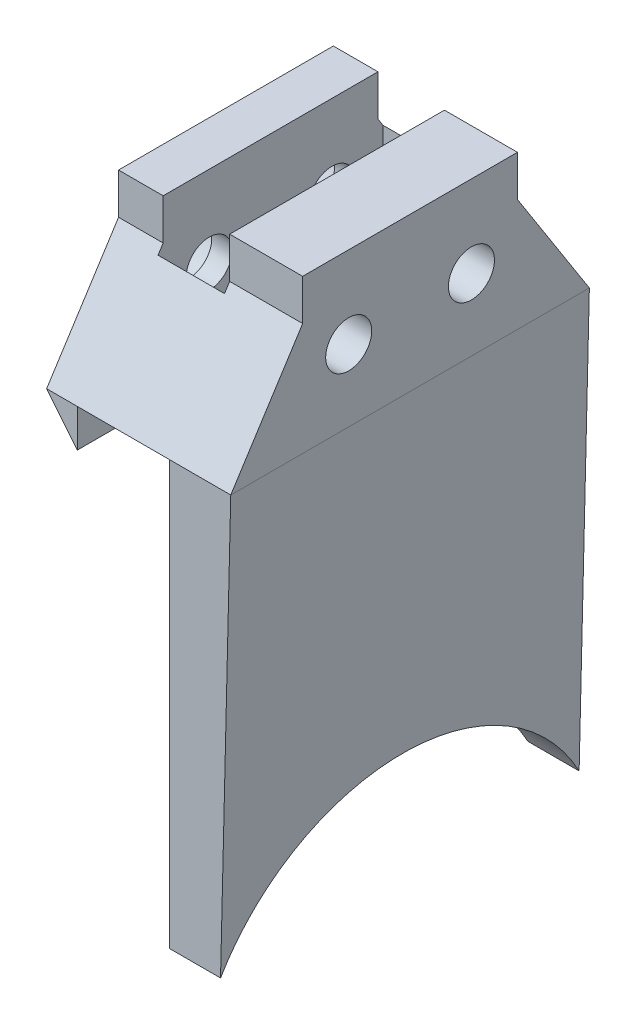
ISO-10303-21;
HEADER;
FILE_DESCRIPTION(('STEP AP214'),'2;1');
FILE_NAME('part.step','',(''),(''),'','','');
FILE_SCHEMA(('AUTOMOTIVE_DESIGN { 1 0 10303 214 1 1 1 1 }'));
ENDSEC;
DATA;
#1=APPLICATION_CONTEXT('core data for automotive mechanical design processes');
#2=APPLICATION_PROTOCOL_DEFINITION('international standard','automotive_design',2000,#1);
#3=PRODUCT_CONTEXT('',#1,'mechanical');
#4=PRODUCT('Part','Part','',(#3));
#5=PRODUCT_RELATED_PRODUCT_CATEGORY('part','',(#4));
#6=PRODUCT_DEFINITION_FORMATION('','',#4);
#7=PRODUCT_DEFINITION_CONTEXT('part definition',#1,'design');
#8=PRODUCT_DEFINITION('design','',#6,#7);
#9=PRODUCT_DEFINITION_SHAPE('','',#8);
#10=(LENGTH_UNIT() NAMED_UNIT(*) SI_UNIT(.MILLI.,.METRE.));
#11=(NAMED_UNIT(*) PLANE_ANGLE_UNIT() SI_UNIT($,.RADIAN.));
#12=(NAMED_UNIT(*) SI_UNIT($,.STERADIAN.) SOLID_ANGLE_UNIT());
#13=UNCERTAINTY_MEASURE_WITH_UNIT(LENGTH_MEASURE(1.E-05),#10,'distance_accuracy_value','');
#14=(GEOMETRIC_REPRESENTATION_CONTEXT(3) GLOBAL_UNCERTAINTY_ASSIGNED_CONTEXT((#13)) GLOBAL_UNIT_ASSIGNED_CONTEXT((#10,
#11,#12)) REPRESENTATION_CONTEXT('',''));
#15=CARTESIAN_POINT('',(0.,0.,0.));
#16=DIRECTION('',(0.,0.,1.));
#17=DIRECTION('',(1.,0.,0.));
#18=AXIS2_PLACEMENT_3D('',#15,#16,#17);
#19=CARTESIAN_POINT('',(6.,-7.5,35.0588586));
#20=DIRECTION('',(0.,1.,0.));
#21=DIRECTION('',(-1.,0.,0.));
#22=AXIS2_PLACEMENT_3D('',#19,#20,#21);
#23=PLANE('',#22);
#24=DIRECTION('',(-1.,0.,0.));
#25=VECTOR('',#24,1.);
#26=CARTESIAN_POINT('',(-1.6375,-7.5,6.5294293));
#27=LINE('',#26,#25);
#28=CARTESIAN_POINT('',(4.8625,-7.5,6.5294293));
#29=VERTEX_POINT('',#28);
#30=CARTESIAN_POINT('',(-1.6375,-7.5,6.5294293));
#31=VERTEX_POINT('',#30);
#32=EDGE_CURVE('E241',#29,#31,#27,.T.);
#33=ORIENTED_EDGE('',*,*,#32,.T.);
#34=DIRECTION('',(0.,0.,1.));
#35=VECTOR('',#34,1.);
#36=CARTESIAN_POINT('',(-1.6375,-7.5,6.5294293));
#37=LINE('',#36,#35);
#38=CARTESIAN_POINT('',(-1.6375,-7.5,28.5294293));
#39=VERTEX_POINT('',#38);
#40=EDGE_CURVE('E233',#31,#39,#37,.T.);
#41=ORIENTED_EDGE('',*,*,#40,.T.);
#42=DIRECTION('',(1.,0.,0.));
#43=VECTOR('',#42,1.);
#44=CARTESIAN_POINT('',(-1.6375,-7.5,28.5294293));
#45=LINE('',#44,#43);
#46=CARTESIAN_POINT('',(4.8625,-7.5,28.5294293));
#47=VERTEX_POINT('',#46);
#48=EDGE_CURVE('E236',#39,#47,#45,.T.);
#49=ORIENTED_EDGE('',*,*,#48,.T.);
#50=DIRECTION('',(0.,0.,-1.));
#51=VECTOR('',#50,1.);
#52=CARTESIAN_POINT('',(4.8625,-7.5,6.5294293));
#53=LINE('',#52,#51);
#54=EDGE_CURVE('E68',#47,#29,#53,.T.);
#55=ORIENTED_EDGE('',*,*,#54,.T.);
#56=EDGE_LOOP('',(#33,#41,#49,#55));
#57=FACE_BOUND('',#56,.T.);
#58=DIRECTION('',(0.,0.,-1.));
#59=VECTOR('',#58,1.);
#60=CARTESIAN_POINT('',(-3.,-7.49999999999995,35.0588586));
#61=LINE('',#60,#59);
#62=CARTESIAN_POINT('',(-3.,-7.5,35.0588586));
#63=VERTEX_POINT('',#62);
#64=CARTESIAN_POINT('',(-3.,-7.49999999999995,0.));
#65=VERTEX_POINT('',#64);
#66=EDGE_CURVE('E198',#63,#65,#61,.T.);
#67=ORIENTED_EDGE('',*,*,#66,.T.);
#68=DIRECTION('',(1.,0.,0.));
#69=VECTOR('',#68,1.);
#70=CARTESIAN_POINT('',(6.,-7.5,0.));
#71=LINE('',#70,#69);
#72=CARTESIAN_POINT('',(6.,-7.49999999999995,0.));
#73=VERTEX_POINT('',#72);
#74=EDGE_CURVE('E334',#65,#73,#71,.T.);
#75=ORIENTED_EDGE('',*,*,#74,.T.);
#76=DIRECTION('',(0.,0.,-1.));
#77=VECTOR('',#76,1.);
#78=CARTESIAN_POINT('',(6.,-7.5,35.0588586));
#79=LINE('',#78,#77);
#80=CARTESIAN_POINT('',(6.,-7.49999999999995,35.0588586));
#81=VERTEX_POINT('',#80);
#82=EDGE_CURVE('E342',#81,#73,#79,.T.);
#83=ORIENTED_EDGE('',*,*,#82,.F.);
#84=DIRECTION('',(1.,0.,0.));
#85=VECTOR('',#84,1.);
#86=CARTESIAN_POINT('',(6.,-7.5,35.0588586));
#87=LINE('',#86,#85);
#88=EDGE_CURVE('E60',#63,#81,#87,.T.);
#89=ORIENTED_EDGE('',*,*,#88,.F.);
#90=EDGE_LOOP('',(#67,#75,#83,#89));
#91=FACE_BOUND('',#90,.T.);
#92=ADVANCED_FACE('F43',(#57,#91),#23,.F.);
#93=CARTESIAN_POINT('',(12.,-0.499999999999999,23.5294293));
#94=DIRECTION('',(-1.,0.,0.));
#95=DIRECTION('',(0.,-1.,0.));
#96=AXIS2_PLACEMENT_3D('',#93,#94,#95);
#97=CYLINDRICAL_SURFACE('',#96,2.25);
#98=CARTESIAN_POINT('',(-1.6375,-0.5,23.5294293));
#99=DIRECTION('',(-1.,0.,0.));
#100=DIRECTION('',(0.,0.,1.));
#101=AXIS2_PLACEMENT_3D('',#98,#99,#100);
#102=CIRCLE('',#101,2.25);
#103=CARTESIAN_POINT('',(-1.6375,-0.5,25.7794293));
#104=VERTEX_POINT('',#103);
#105=EDGE_CURVE('E225',#104,#104,#102,.T.);
#106=ORIENTED_EDGE('',*,*,#105,.F.);
#107=EDGE_LOOP('',(#106));
#108=FACE_BOUND('',#107,.T.);
#109=CARTESIAN_POINT('',(-3.6375,-0.5,23.5294293));
#110=DIRECTION('',(-1.,0.,0.));
#111=DIRECTION('',(0.,-1.,0.));
#112=AXIS2_PLACEMENT_3D('',#109,#110,#111);
#113=CIRCLE('',#112,2.25);
#114=CARTESIAN_POINT('',(-3.6375,-2.75,23.5294293));
#115=VERTEX_POINT('',#114);
#116=EDGE_CURVE('E47',#115,#115,#113,.F.);
#117=ORIENTED_EDGE('',*,*,#116,.F.);
#118=EDGE_LOOP('',(#117));
#119=FACE_BOUND('',#118,.T.);
#120=ADVANCED_FACE('F366',(#108,#119),#97,.F.);
#121=CARTESIAN_POINT('',(12.,-0.499999999999999,11.5294293));
#122=DIRECTION('',(-1.,0.,0.));
#123=DIRECTION('',(0.,-1.,0.));
#124=AXIS2_PLACEMENT_3D('',#121,#122,#123);
#125=CYLINDRICAL_SURFACE('',#124,2.25);
#126=CARTESIAN_POINT('',(-1.6375,-0.5,11.5294293));
#127=DIRECTION('',(-1.,0.,0.));
#128=DIRECTION('',(0.,0.,1.));
#129=AXIS2_PLACEMENT_3D('',#126,#127,#128);
#130=CIRCLE('',#129,2.25);
#131=CARTESIAN_POINT('',(-1.6375,-0.5,13.7794293));
#132=VERTEX_POINT('',#131);
#133=EDGE_CURVE('E229',#132,#132,#130,.T.);
#134=ORIENTED_EDGE('',*,*,#133,.F.);
#135=EDGE_LOOP('',(#134));
#136=FACE_BOUND('',#135,.T.);
#137=CARTESIAN_POINT('',(-3.6375,-0.5,11.5294293));
#138=DIRECTION('',(-1.,0.,0.));
#139=DIRECTION('',(0.,-1.,0.));
#140=AXIS2_PLACEMENT_3D('',#137,#138,#139);
#141=CIRCLE('',#140,2.25);
#142=CARTESIAN_POINT('',(-3.6375,-2.75,11.5294293));
#143=VERTEX_POINT('',#142);
#144=EDGE_CURVE('E209',#143,#143,#141,.F.);
#145=ORIENTED_EDGE('',*,*,#144,.F.);
#146=EDGE_LOOP('',(#145));
#147=FACE_BOUND('',#146,.T.);
#148=ADVANCED_FACE('F368',(#136,#147),#125,.F.);
#149=CARTESIAN_POINT('',(6.,7.5,35.0588586));
#150=DIRECTION('',(0.,-1.,0.));
#151=DIRECTION('',(1.,0.,0.));
#152=AXIS2_PLACEMENT_3D('',#149,#150,#151);
#153=PLANE('',#152);
#154=DIRECTION('',(-1.,0.,0.));
#155=VECTOR('',#154,1.);
#156=CARTESIAN_POINT('',(12.,7.49999999999995,28.0294293));
#157=LINE('',#156,#155);
#158=CARTESIAN_POINT('',(-1.6375,7.5,28.0294293));
#159=VERTEX_POINT('',#158);
#160=CARTESIAN_POINT('',(-6.,7.49999999999995,28.0294293));
#161=VERTEX_POINT('',#160);
#162=EDGE_CURVE('E309',#159,#161,#157,.T.);
#163=ORIENTED_EDGE('',*,*,#162,.F.);
#164=DIRECTION('',(0.,0.,1.));
#165=VECTOR('',#164,1.);
#166=CARTESIAN_POINT('',(-1.6375,7.5,6.5294293));
#167=LINE('',#166,#165);
#168=CARTESIAN_POINT('',(-1.6375,7.5,7.0294293));
#169=VERTEX_POINT('',#168);
#170=EDGE_CURVE('E232',#169,#159,#167,.T.);
#171=ORIENTED_EDGE('',*,*,#170,.F.);
#172=DIRECTION('',(-1.,0.,0.));
#173=VECTOR('',#172,1.);
#174=CARTESIAN_POINT('',(12.,7.49999999999995,7.0294293));
#175=LINE('',#174,#173);
#176=CARTESIAN_POINT('',(-6.,7.5,7.0294293));
#177=VERTEX_POINT('',#176);
#178=EDGE_CURVE('E281',#169,#177,#175,.T.);
#179=ORIENTED_EDGE('',*,*,#178,.T.);
#180=DIRECTION('',(0.,0.,-1.));
#181=VECTOR('',#180,1.);
#182=CARTESIAN_POINT('',(-6.,7.5,35.0588586));
#183=LINE('',#182,#181);
#184=EDGE_CURVE('E336',#161,#177,#183,.T.);
#185=ORIENTED_EDGE('',*,*,#184,.F.);
#186=EDGE_LOOP('',(#163,#171,#179,#185));
#187=FACE_BOUND('',#186,.T.);
#188=ADVANCED_FACE('F376',(#187),#153,.F.);
#189=CARTESIAN_POINT('',(12.,7.49999999999995,28.0294293));
#190=DIRECTION('',(0.,0.,1.));
#191=DIRECTION('',(0.,-1.,0.));
#192=AXIS2_PLACEMENT_3D('',#189,#190,#191);
#193=PLANE('',#192);
#194=DIRECTION('',(0.,-1.,0.));
#195=VECTOR('',#194,1.);
#196=CARTESIAN_POINT('',(-1.6375,7.49999999999995,28.0294293));
#197=LINE('',#196,#195);
#198=CARTESIAN_POINT('',(-1.6375,3.49999999999995,28.0294293));
#199=VERTEX_POINT('',#198);
#200=EDGE_CURVE('E267',#159,#199,#197,.T.);
#201=ORIENTED_EDGE('',*,*,#200,.F.);
#202=ORIENTED_EDGE('',*,*,#162,.T.);
#203=DIRECTION('',(0.,1.,0.));
#204=VECTOR('',#203,1.);
#205=CARTESIAN_POINT('',(-6.,7.49999999999995,28.0294293));
#206=LINE('',#205,#204);
#207=CARTESIAN_POINT('',(-6.,3.49999999999995,28.0294293));
#208=VERTEX_POINT('',#207);
#209=EDGE_CURVE('E269',#208,#161,#206,.T.);
#210=ORIENTED_EDGE('',*,*,#209,.F.);
#211=DIRECTION('',(-1.,0.,0.));
#212=VECTOR('',#211,1.);
#213=CARTESIAN_POINT('',(12.,3.49999999999995,28.0294293));
#214=LINE('',#213,#212);
#215=EDGE_CURVE('E302',#199,#208,#214,.T.);
#216=ORIENTED_EDGE('',*,*,#215,.F.);
#217=EDGE_LOOP('',(#201,#202,#210,#216));
#218=FACE_BOUND('',#217,.T.);
#219=ADVANCED_FACE('F476',(#218),#193,.T.);
#220=CARTESIAN_POINT('',(12.,7.49999999999995,7.0294293));
#221=DIRECTION('',(0.,0.,-1.));
#222=DIRECTION('',(0.,1.,0.));
#223=AXIS2_PLACEMENT_3D('',#220,#221,#222);
#224=PLANE('',#223);
#225=DIRECTION('',(0.,1.,0.));
#226=VECTOR('',#225,1.);
#227=CARTESIAN_POINT('',(-1.6375,7.49999999999995,7.0294293));
#228=LINE('',#227,#226);
#229=CARTESIAN_POINT('',(-1.6375,3.49999999999995,7.0294293));
#230=VERTEX_POINT('',#229);
#231=EDGE_CURVE('E263',#230,#169,#228,.T.);
#232=ORIENTED_EDGE('',*,*,#231,.F.);
#233=DIRECTION('',(-1.,0.,0.));
#234=VECTOR('',#233,1.);
#235=CARTESIAN_POINT('',(12.,3.49999999999995,7.0294293));
#236=LINE('',#235,#234);
#237=CARTESIAN_POINT('',(-6.,3.49999999999995,7.0294293));
#238=VERTEX_POINT('',#237);
#239=EDGE_CURVE('E288',#230,#238,#236,.T.);
#240=ORIENTED_EDGE('',*,*,#239,.T.);
#241=DIRECTION('',(0.,-1.,0.));
#242=VECTOR('',#241,1.);
#243=CARTESIAN_POINT('',(-6.,7.49999999999995,7.0294293));
#244=LINE('',#243,#242);
#245=EDGE_CURVE('E270',#177,#238,#244,.T.);
#246=ORIENTED_EDGE('',*,*,#245,.F.);
#247=ORIENTED_EDGE('',*,*,#178,.F.);
#248=EDGE_LOOP('',(#232,#240,#246,#247));
#249=FACE_BOUND('',#248,.T.);
#250=ADVANCED_FACE('F465',(#249),#224,.T.);
#251=CARTESIAN_POINT('',(0.,0.,35.0588586));
#252=DIRECTION('',(0.,0.,-1.));
#253=DIRECTION('',(-1.,0.,0.));
#254=AXIS2_PLACEMENT_3D('',#251,#252,#253);
#255=PLANE('',#254);
#256=DIRECTION('',(-1.,0.,0.));
#257=VECTOR('',#256,1.);
#258=CARTESIAN_POINT('',(12.,-7.49999999999995,35.0588586));
#259=LINE('',#258,#257);
#260=CARTESIAN_POINT('',(12.,-7.49999999999995,35.0588586));
#261=VERTEX_POINT('',#260);
#262=EDGE_CURVE('E306',#261,#81,#259,.T.);
#263=ORIENTED_EDGE('',*,*,#262,.T.);
#264=DIRECTION('',(0.,-1.,0.));
#265=VECTOR('',#264,1.);
#266=CARTESIAN_POINT('',(6.,7.5,35.0588586));
#267=LINE('',#266,#265);
#268=CARTESIAN_POINT('',(6.00000000000001,-48.8959251,35.0588586));
#269=VERTEX_POINT('',#268);
#270=EDGE_CURVE('E326',#81,#269,#267,.T.);
#271=ORIENTED_EDGE('',*,*,#270,.T.);
#272=DIRECTION('',(-1.,0.,0.));
#273=VECTOR('',#272,1.);
#274=CARTESIAN_POINT('',(12.,-48.8959251,35.0588586));
#275=LINE('',#274,#273);
#276=CARTESIAN_POINT('',(11.,-48.8959251,35.0588586));
#277=VERTEX_POINT('',#276);
#278=EDGE_CURVE('E332',#277,#269,#275,.T.);
#279=ORIENTED_EDGE('',*,*,#278,.F.);
#280=DIRECTION('',(-0.0241499216576646,-0.999708348111552,0.));
#281=VECTOR('',#280,1.);
#282=CARTESIAN_POINT('',(12.1740729625627,-0.294088679819423,35.0588586));
#283=LINE('',#282,#281);
#284=EDGE_CURVE('E314',#261,#277,#283,.T.);
#285=ORIENTED_EDGE('',*,*,#284,.F.);
#286=EDGE_LOOP('',(#263,#271,#279,#285));
#287=FACE_BOUND('',#286,.T.);
#288=ADVANCED_FACE('F440',(#287),#255,.F.);
#289=CARTESIAN_POINT('',(0.,0.,0.));
#290=DIRECTION('',(0.,0.,-1.));
#291=DIRECTION('',(-1.,0.,0.));
#292=AXIS2_PLACEMENT_3D('',#289,#290,#291);
#293=PLANE('',#292);
#294=DIRECTION('',(0.,1.,0.));
#295=VECTOR('',#294,1.);
#296=CARTESIAN_POINT('',(6.,7.5,0.));
#297=LINE('',#296,#295);
#298=CARTESIAN_POINT('',(6.00000000000001,-48.8959251,0.));
#299=VERTEX_POINT('',#298);
#300=EDGE_CURVE('E318',#299,#73,#297,.T.);
#301=ORIENTED_EDGE('',*,*,#300,.T.);
#302=DIRECTION('',(-1.,0.,0.));
#303=VECTOR('',#302,1.);
#304=CARTESIAN_POINT('',(12.,-7.49999999999995,0.));
#305=LINE('',#304,#303);
#306=CARTESIAN_POINT('',(12.,-7.49999999999995,0.));
#307=VERTEX_POINT('',#306);
#308=EDGE_CURVE('E285',#307,#73,#305,.T.);
#309=ORIENTED_EDGE('',*,*,#308,.F.);
#310=DIRECTION('',(-0.0241499216576646,-0.999708348111552,0.));
#311=VECTOR('',#310,1.);
#312=CARTESIAN_POINT('',(12.1740729625627,-0.294088679819423,0.));
#313=LINE('',#312,#311);
#314=CARTESIAN_POINT('',(11.,-48.8959251,0.));
#315=VERTEX_POINT('',#314);
#316=EDGE_CURVE('E292',#307,#315,#313,.T.);
#317=ORIENTED_EDGE('',*,*,#316,.T.);
#318=DIRECTION('',(-1.,0.,0.));
#319=VECTOR('',#318,1.);
#320=CARTESIAN_POINT('',(12.,-48.8959251,0.));
#321=LINE('',#320,#319);
#322=EDGE_CURVE('E322',#315,#299,#321,.T.);
#323=ORIENTED_EDGE('',*,*,#322,.T.);
#324=EDGE_LOOP('',(#301,#309,#317,#323));
#325=FACE_BOUND('',#324,.T.);
#326=ADVANCED_FACE('F455',(#325),#293,.T.);
#327=CARTESIAN_POINT('',(12.,-58.5250012974502,17.5294293));
#328=DIRECTION('',(1.,0.,0.));
#329=DIRECTION('',(0.,1.,0.));
#330=AXIS2_PLACEMENT_3D('',#327,#328,#329);
#331=PLANE('',#330);
#332=CARTESIAN_POINT('',(12.,-0.499999999999999,11.5294293));
#333=DIRECTION('',(-1.,0.,0.));
#334=DIRECTION('',(0.,-1.,0.));
#335=AXIS2_PLACEMENT_3D('',#332,#333,#334);
#336=CIRCLE('',#335,2.25);
#337=CARTESIAN_POINT('',(12.,-2.75,11.5294293));
#338=VERTEX_POINT('',#337);
#339=EDGE_CURVE('E218',#338,#338,#336,.T.);
#340=ORIENTED_EDGE('',*,*,#339,.T.);
#341=EDGE_LOOP('',(#340));
#342=FACE_BOUND('',#341,.T.);
#343=CARTESIAN_POINT('',(12.,-0.499999999999999,23.5294293));
#344=DIRECTION('',(-1.,0.,0.));
#345=DIRECTION('',(0.,-1.,0.));
#346=AXIS2_PLACEMENT_3D('',#343,#344,#345);
#347=CIRCLE('',#346,2.25);
#348=CARTESIAN_POINT('',(12.,-2.75,23.5294293));
#349=VERTEX_POINT('',#348);
#350=EDGE_CURVE('E222',#349,#349,#347,.T.);
#351=ORIENTED_EDGE('',*,*,#350,.T.);
#352=EDGE_LOOP('',(#351));
#353=FACE_BOUND('',#352,.T.);
#354=DIRECTION('',(0.,-0.842638856504142,-0.538479115202615));
#355=VECTOR('',#354,1.);
#356=CARTESIAN_POINT('',(12.,3.49999999999995,7.0294293));
#357=LINE('',#356,#355);
#358=CARTESIAN_POINT('',(12.,3.49999999999995,7.0294293));
#359=VERTEX_POINT('',#358);
#360=EDGE_CURVE('E279',#359,#307,#357,.T.);
#361=ORIENTED_EDGE('',*,*,#360,.F.);
#362=DIRECTION('',(0.,-1.,0.));
#363=VECTOR('',#362,1.);
#364=CARTESIAN_POINT('',(12.,7.49999999999995,7.0294293));
#365=LINE('',#364,#363);
#366=CARTESIAN_POINT('',(12.,7.49999999999995,7.0294293));
#367=VERTEX_POINT('',#366);
#368=EDGE_CURVE('E277',#367,#359,#365,.T.);
#369=ORIENTED_EDGE('',*,*,#368,.F.);
#370=DIRECTION('',(0.,0.,1.));
#371=VECTOR('',#370,1.);
#372=CARTESIAN_POINT('',(12.,7.5,0.));
#373=LINE('',#372,#371);
#374=CARTESIAN_POINT('',(12.,7.5,28.0294293));
#375=VERTEX_POINT('',#374);
#376=EDGE_CURVE('E319',#367,#375,#373,.T.);
#377=ORIENTED_EDGE('',*,*,#376,.T.);
#378=DIRECTION('',(0.,1.,0.));
#379=VECTOR('',#378,1.);
#380=CARTESIAN_POINT('',(12.,7.49999999999995,28.0294293));
#381=LINE('',#380,#379);
#382=CARTESIAN_POINT('',(12.,3.49999999999995,28.0294293));
#383=VERTEX_POINT('',#382);
#384=EDGE_CURVE('E298',#383,#375,#381,.T.);
#385=ORIENTED_EDGE('',*,*,#384,.F.);
#386=DIRECTION('',(0.,0.842638856504142,-0.538479115202615));
#387=VECTOR('',#386,1.);
#388=CARTESIAN_POINT('',(12.,3.49999999999995,28.0294293));
#389=LINE('',#388,#387);
#390=EDGE_CURVE('E300',#261,#383,#389,.T.);
#391=ORIENTED_EDGE('',*,*,#390,.F.);
#392=DIRECTION('',(0.,0.,-1.));
#393=VECTOR('',#392,1.);
#394=CARTESIAN_POINT('',(12.,-7.50000000000017,17.5294293));
#395=LINE('',#394,#393);
#396=EDGE_CURVE('E347',#261,#307,#395,.T.);
#397=ORIENTED_EDGE('',*,*,#396,.T.);
#398=EDGE_LOOP('',(#361,#369,#377,#385,#391,#397));
#399=FACE_BOUND('',#398,.T.);
#400=ADVANCED_FACE('F418',(#342,#353,#399),#331,.T.);
#401=CARTESIAN_POINT('',(-6.,7.5,35.0588586));
#402=DIRECTION('',(1.,0.,0.));
#403=DIRECTION('',(0.,1.,0.));
#404=AXIS2_PLACEMENT_3D('',#401,#402,#403);
#405=PLANE('',#404);
#406=CARTESIAN_POINT('',(-6.,-0.500000000000001,11.5294293));
#407=DIRECTION('',(-1.,0.,0.));
#408=DIRECTION('',(0.,-1.,0.));
#409=AXIS2_PLACEMENT_3D('',#406,#407,#408);
#410=CIRCLE('',#409,3.75);
#411=CARTESIAN_POINT('',(-6.,-4.25,11.5294293));
#412=VERTEX_POINT('',#411);
#413=EDGE_CURVE('E210',#412,#412,#410,.T.);
#414=ORIENTED_EDGE('',*,*,#413,.F.);
#415=EDGE_LOOP('',(#414));
#416=FACE_BOUND('',#415,.T.);
#417=CARTESIAN_POINT('',(-6.,-0.500000000000001,23.5294293));
#418=DIRECTION('',(-1.,0.,0.));
#419=DIRECTION('',(0.,-1.,0.));
#420=AXIS2_PLACEMENT_3D('',#417,#418,#419);
#421=CIRCLE('',#420,3.75);
#422=CARTESIAN_POINT('',(-6.,-4.25,23.5294293));
#423=VERTEX_POINT('',#422);
#424=EDGE_CURVE('E197',#423,#423,#421,.T.);
#425=ORIENTED_EDGE('',*,*,#424,.F.);
#426=EDGE_LOOP('',(#425));
#427=FACE_BOUND('',#426,.T.);
#428=ORIENTED_EDGE('',*,*,#245,.T.);
#429=DIRECTION('',(0.,-0.842638856504142,-0.538479115202615));
#430=VECTOR('',#429,1.);
#431=CARTESIAN_POINT('',(-6.,3.49999999999995,7.0294293));
#432=LINE('',#431,#430);
#433=CARTESIAN_POINT('',(-6.,-7.49999999999995,0.));
#434=VERTEX_POINT('',#433);
#435=EDGE_CURVE('E273',#238,#434,#432,.T.);
#436=ORIENTED_EDGE('',*,*,#435,.T.);
#437=DIRECTION('',(0.,0.,-1.));
#438=VECTOR('',#437,1.);
#439=CARTESIAN_POINT('',(-6.,-7.5,35.0588586));
#440=LINE('',#439,#438);
#441=CARTESIAN_POINT('',(-6.,-7.49999999999995,35.0588586));
#442=VERTEX_POINT('',#441);
#443=EDGE_CURVE('E345',#442,#434,#440,.T.);
#444=ORIENTED_EDGE('',*,*,#443,.F.);
#445=DIRECTION('',(0.,0.842638856504142,-0.538479115202615));
#446=VECTOR('',#445,1.);
#447=CARTESIAN_POINT('',(-6.,3.49999999999995,28.0294293));
#448=LINE('',#447,#446);
#449=EDGE_CURVE('E295',#442,#208,#448,.T.);
#450=ORIENTED_EDGE('',*,*,#449,.T.);
#451=ORIENTED_EDGE('',*,*,#209,.T.);
#452=ORIENTED_EDGE('',*,*,#184,.T.);
#453=EDGE_LOOP('',(#428,#436,#444,#450,#451,#452));
#454=FACE_BOUND('',#453,.T.);
#455=ADVANCED_FACE('F45',(#416,#427,#454),#405,.F.);
#456=CARTESIAN_POINT('',(4.8625,7.5,7.0294293));
#457=VERTEX_POINT('',#456);
#458=EDGE_CURVE('E282',#367,#457,#175,.T.);
#459=ORIENTED_EDGE('',*,*,#458,.T.);
#460=DIRECTION('',(0.,0.,-1.));
#461=VECTOR('',#460,1.);
#462=CARTESIAN_POINT('',(4.8625,7.5,6.5294293));
#463=LINE('',#462,#461);
#464=CARTESIAN_POINT('',(4.8625,7.5,28.0294293));
#465=VERTEX_POINT('',#464);
#466=EDGE_CURVE('E237',#465,#457,#463,.T.);
#467=ORIENTED_EDGE('',*,*,#466,.F.);
#468=EDGE_CURVE('E274',#375,#465,#157,.T.);
#469=ORIENTED_EDGE('',*,*,#468,.F.);
#470=ORIENTED_EDGE('',*,*,#376,.F.);
#471=EDGE_LOOP('',(#459,#467,#469,#470));
#472=FACE_BOUND('',#471,.T.);
#473=ADVANCED_FACE('F411',(#472),#153,.F.);
#474=CARTESIAN_POINT('',(12.,-58.5250012974502,17.5294293));
#475=DIRECTION('',(-1.,0.,0.));
#476=DIRECTION('',(0.,-1.,0.));
#477=AXIS2_PLACEMENT_3D('',#474,#475,#476);
#478=CYLINDRICAL_SURFACE('',#477,20.);
#479=CARTESIAN_POINT('',(10.7673907232611,-58.5250012974502,17.5294293));
#480=DIRECTION('',(0.999708348111552,-0.0241499216576646,0.));
#481=DIRECTION('',(-0.0241499216576646,-0.999708348111552,0.));
#482=AXIS2_PLACEMENT_3D('',#479,#480,#481);
#483=ELLIPSE('',#482,20.0058347394817,20.);
#484=EDGE_CURVE('E316',#277,#315,#483,.F.);
#485=ORIENTED_EDGE('',*,*,#484,.F.);
#486=ORIENTED_EDGE('',*,*,#278,.T.);
#487=CARTESIAN_POINT('',(6.00000000000001,-58.5250012974502,17.5294293));
#488=DIRECTION('',(-1.,0.,0.));
#489=DIRECTION('',(0.,1.,0.));
#490=AXIS2_PLACEMENT_3D('',#487,#488,#489);
#491=CIRCLE('',#490,20.);
#492=EDGE_CURVE('E323',#269,#299,#491,.T.);
#493=ORIENTED_EDGE('',*,*,#492,.T.);
#494=ORIENTED_EDGE('',*,*,#322,.F.);
#495=EDGE_LOOP('',(#485,#486,#493,#494));
#496=FACE_BOUND('',#495,.T.);
#497=ADVANCED_FACE('F450',(#496),#478,.F.);
#498=CARTESIAN_POINT('',(6.00000000000001,-58.5250012974502,17.5294293));
#499=DIRECTION('',(1.,0.,0.));
#500=DIRECTION('',(0.,1.,0.));
#501=AXIS2_PLACEMENT_3D('',#498,#499,#500);
#502=PLANE('',#501);
#503=ORIENTED_EDGE('',*,*,#270,.F.);
#504=ORIENTED_EDGE('',*,*,#82,.T.);
#505=ORIENTED_EDGE('',*,*,#300,.F.);
#506=ORIENTED_EDGE('',*,*,#492,.F.);
#507=EDGE_LOOP('',(#503,#504,#505,#506));
#508=FACE_BOUND('',#507,.T.);
#509=ADVANCED_FACE('F446',(#508),#502,.F.);
#510=CARTESIAN_POINT('',(12.1740729625627,-0.294088679819423,0.));
#511=DIRECTION('',(0.999708348111552,-0.0241499216576646,0.));
#512=DIRECTION('',(0.0241499216576646,0.999708348111552,0.));
#513=AXIS2_PLACEMENT_3D('',#510,#511,#512);
#514=PLANE('',#513);
#515=ORIENTED_EDGE('',*,*,#484,.T.);
#516=ORIENTED_EDGE('',*,*,#316,.F.);
#517=ORIENTED_EDGE('',*,*,#396,.F.);
#518=ORIENTED_EDGE('',*,*,#284,.T.);
#519=EDGE_LOOP('',(#515,#516,#517,#518));
#520=FACE_BOUND('',#519,.T.);
#521=ADVANCED_FACE('F453',(#520),#514,.T.);
#522=DIRECTION('',(0.,1.,0.));
#523=VECTOR('',#522,1.);
#524=CARTESIAN_POINT('',(4.8625,7.49999999999995,28.0294293));
#525=LINE('',#524,#523);
#526=CARTESIAN_POINT('',(4.8625,3.49999999999995,28.0294293));
#527=VERTEX_POINT('',#526);
#528=EDGE_CURVE('E261',#527,#465,#525,.T.);
#529=ORIENTED_EDGE('',*,*,#528,.F.);
#530=EDGE_CURVE('E303',#383,#527,#214,.T.);
#531=ORIENTED_EDGE('',*,*,#530,.F.);
#532=ORIENTED_EDGE('',*,*,#384,.T.);
#533=ORIENTED_EDGE('',*,*,#468,.T.);
#534=EDGE_LOOP('',(#529,#531,#532,#533));
#535=FACE_BOUND('',#534,.T.);
#536=ADVANCED_FACE('F413',(#535),#193,.T.);
#537=CARTESIAN_POINT('',(12.,3.49999999999995,28.0294293));
#538=DIRECTION('',(0.,0.538479115202615,0.842638856504142));
#539=DIRECTION('',(0.,-0.842638856504142,0.538479115202615));
#540=AXIS2_PLACEMENT_3D('',#537,#538,#539);
#541=PLANE('',#540);
#542=DIRECTION('',(0.,-0.842638856504142,0.538479115202615));
#543=VECTOR('',#542,1.);
#544=CARTESIAN_POINT('',(-1.6375,3.49999999999995,28.0294293));
#545=LINE('',#544,#543);
#546=CARTESIAN_POINT('',(-1.6375,2.71757517356346,28.5294293));
#547=VERTEX_POINT('',#546);
#548=EDGE_CURVE('E265',#199,#547,#545,.T.);
#549=ORIENTED_EDGE('',*,*,#548,.F.);
#550=ORIENTED_EDGE('',*,*,#215,.T.);
#551=ORIENTED_EDGE('',*,*,#449,.F.);
#552=EDGE_CURVE('E184',#442,#63,#87,.T.);
#553=ORIENTED_EDGE('',*,*,#552,.T.);
#554=ORIENTED_EDGE('',*,*,#88,.T.);
#555=ORIENTED_EDGE('',*,*,#262,.F.);
#556=ORIENTED_EDGE('',*,*,#390,.T.);
#557=ORIENTED_EDGE('',*,*,#530,.T.);
#558=DIRECTION('',(0.,0.842638856504142,-0.538479115202615));
#559=VECTOR('',#558,1.);
#560=CARTESIAN_POINT('',(4.8625,3.49999999999995,28.0294293));
#561=LINE('',#560,#559);
#562=CARTESIAN_POINT('',(4.8625,2.71757517356346,28.5294293));
#563=VERTEX_POINT('',#562);
#564=EDGE_CURVE('E259',#563,#527,#561,.T.);
#565=ORIENTED_EDGE('',*,*,#564,.F.);
#566=DIRECTION('',(1.,0.,0.));
#567=VECTOR('',#566,1.);
#568=CARTESIAN_POINT('',(12.,2.71757517356346,28.5294293));
#569=LINE('',#568,#567);
#570=EDGE_CURVE('E11',#547,#563,#569,.T.);
#571=ORIENTED_EDGE('',*,*,#570,.F.);
#572=EDGE_LOOP('',(#549,#550,#551,#553,#554,#555,#556,#557,#565,#571));
#573=FACE_BOUND('',#572,.T.);
#574=ADVANCED_FACE('F437',(#573),#541,.T.);
#575=DIRECTION('',(0.,-1.,0.));
#576=VECTOR('',#575,1.);
#577=CARTESIAN_POINT('',(4.8625,7.49999999999995,7.0294293));
#578=LINE('',#577,#576);
#579=CARTESIAN_POINT('',(4.8625,3.49999999999995,7.0294293));
#580=VERTEX_POINT('',#579);
#581=EDGE_CURVE('E250',#457,#580,#578,.T.);
#582=ORIENTED_EDGE('',*,*,#581,.F.);
#583=ORIENTED_EDGE('',*,*,#458,.F.);
#584=ORIENTED_EDGE('',*,*,#368,.T.);
#585=EDGE_CURVE('E289',#359,#580,#236,.T.);
#586=ORIENTED_EDGE('',*,*,#585,.T.);
#587=EDGE_LOOP('',(#582,#583,#584,#586));
#588=FACE_BOUND('',#587,.T.);
#589=ADVANCED_FACE('F423',(#588),#224,.T.);
#590=CARTESIAN_POINT('',(12.,3.49999999999995,7.0294293));
#591=DIRECTION('',(0.,0.538479115202615,-0.842638856504142));
#592=DIRECTION('',(0.,0.842638856504142,0.538479115202615));
#593=AXIS2_PLACEMENT_3D('',#590,#591,#592);
#594=PLANE('',#593);
#595=DIRECTION('',(0.,0.842638856504142,0.538479115202615));
#596=VECTOR('',#595,1.);
#597=CARTESIAN_POINT('',(-1.6375,3.49999999999995,7.0294293));
#598=LINE('',#597,#596);
#599=CARTESIAN_POINT('',(-1.6375,2.71757517356348,6.5294293));
#600=VERTEX_POINT('',#599);
#601=EDGE_CURVE('E52',#600,#230,#598,.T.);
#602=ORIENTED_EDGE('',*,*,#601,.F.);
#603=DIRECTION('',(-1.,0.,0.));
#604=VECTOR('',#603,1.);
#605=CARTESIAN_POINT('',(12.,2.71757517356348,6.5294293));
#606=LINE('',#605,#604);
#607=CARTESIAN_POINT('',(4.8625,2.71757517356348,6.5294293));
#608=VERTEX_POINT('',#607);
#609=EDGE_CURVE('E352',#608,#600,#606,.T.);
#610=ORIENTED_EDGE('',*,*,#609,.F.);
#611=DIRECTION('',(0.,-0.842638856504142,-0.538479115202615));
#612=VECTOR('',#611,1.);
#613=CARTESIAN_POINT('',(4.8625,3.49999999999995,7.0294293));
#614=LINE('',#613,#612);
#615=EDGE_CURVE('E350',#580,#608,#614,.T.);
#616=ORIENTED_EDGE('',*,*,#615,.F.);
#617=ORIENTED_EDGE('',*,*,#585,.F.);
#618=ORIENTED_EDGE('',*,*,#360,.T.);
#619=ORIENTED_EDGE('',*,*,#308,.T.);
#620=ORIENTED_EDGE('',*,*,#74,.F.);
#621=EDGE_CURVE('E337',#434,#65,#71,.T.);
#622=ORIENTED_EDGE('',*,*,#621,.F.);
#623=ORIENTED_EDGE('',*,*,#435,.F.);
#624=ORIENTED_EDGE('',*,*,#239,.F.);
#625=EDGE_LOOP('',(#602,#610,#616,#617,#618,#619,#620,#622,#623,#624));
#626=FACE_BOUND('',#625,.T.);
#627=ADVANCED_FACE('F427',(#626),#594,.T.);
#628=CARTESIAN_POINT('',(-1.6375,-7.5,6.5294293));
#629=DIRECTION('',(-1.,0.,0.));
#630=DIRECTION('',(0.,0.,1.));
#631=AXIS2_PLACEMENT_3D('',#628,#629,#630);
#632=PLANE('',#631);
#633=ORIENTED_EDGE('',*,*,#133,.T.);
#634=EDGE_LOOP('',(#633));
#635=FACE_BOUND('',#634,.T.);
#636=ORIENTED_EDGE('',*,*,#105,.T.);
#637=EDGE_LOOP('',(#636));
#638=FACE_BOUND('',#637,.T.);
#639=ORIENTED_EDGE('',*,*,#200,.T.);
#640=ORIENTED_EDGE('',*,*,#548,.T.);
#641=DIRECTION('',(0.,1.,0.));
#642=VECTOR('',#641,1.);
#643=CARTESIAN_POINT('',(-1.6375,-7.5,28.5294293));
#644=LINE('',#643,#642);
#645=EDGE_CURVE('E244',#39,#547,#644,.T.);
#646=ORIENTED_EDGE('',*,*,#645,.F.);
#647=ORIENTED_EDGE('',*,*,#40,.F.);
#648=DIRECTION('',(0.,1.,0.));
#649=VECTOR('',#648,1.);
#650=CARTESIAN_POINT('',(-1.6375,-7.5,6.5294293));
#651=LINE('',#650,#649);
#652=EDGE_CURVE('E247',#31,#600,#651,.T.);
#653=ORIENTED_EDGE('',*,*,#652,.T.);
#654=ORIENTED_EDGE('',*,*,#601,.T.);
#655=ORIENTED_EDGE('',*,*,#231,.T.);
#656=ORIENTED_EDGE('',*,*,#170,.T.);
#657=EDGE_LOOP('',(#639,#640,#646,#647,#653,#654,#655,#656));
#658=FACE_BOUND('',#657,.T.);
#659=ADVANCED_FACE('F469',(#635,#638,#658),#632,.F.);
#660=CARTESIAN_POINT('',(-1.6375,-7.5,6.5294293));
#661=DIRECTION('',(0.,0.,-1.));
#662=DIRECTION('',(-1.,0.,0.));
#663=AXIS2_PLACEMENT_3D('',#660,#661,#662);
#664=PLANE('',#663);
#665=ORIENTED_EDGE('',*,*,#609,.T.);
#666=ORIENTED_EDGE('',*,*,#652,.F.);
#667=ORIENTED_EDGE('',*,*,#32,.F.);
#668=DIRECTION('',(0.,1.,0.));
#669=VECTOR('',#668,1.);
#670=CARTESIAN_POINT('',(4.8625,-7.5,6.5294293));
#671=LINE('',#670,#669);
#672=EDGE_CURVE('E251',#29,#608,#671,.T.);
#673=ORIENTED_EDGE('',*,*,#672,.T.);
#674=EDGE_LOOP('',(#665,#666,#667,#673));
#675=FACE_BOUND('',#674,.T.);
#676=ADVANCED_FACE('F400',(#675),#664,.F.);
#677=CARTESIAN_POINT('',(4.8625,-7.5,6.5294293));
#678=DIRECTION('',(1.,0.,0.));
#679=DIRECTION('',(0.,0.,-1.));
#680=AXIS2_PLACEMENT_3D('',#677,#678,#679);
#681=PLANE('',#680);
#682=CARTESIAN_POINT('',(4.8625,-0.499999999999999,11.5294293));
#683=DIRECTION('',(1.,0.,0.));
#684=DIRECTION('',(0.,0.,-1.));
#685=AXIS2_PLACEMENT_3D('',#682,#683,#684);
#686=CIRCLE('',#685,2.25);
#687=CARTESIAN_POINT('',(4.8625,-0.499999999999999,9.2794293));
#688=VERTEX_POINT('',#687);
#689=EDGE_CURVE('E228',#688,#688,#686,.T.);
#690=ORIENTED_EDGE('',*,*,#689,.T.);
#691=EDGE_LOOP('',(#690));
#692=FACE_BOUND('',#691,.T.);
#693=CARTESIAN_POINT('',(4.8625,-0.499999999999999,23.5294293));
#694=DIRECTION('',(1.,0.,0.));
#695=DIRECTION('',(0.,0.,-1.));
#696=AXIS2_PLACEMENT_3D('',#693,#694,#695);
#697=CIRCLE('',#696,2.25);
#698=CARTESIAN_POINT('',(4.8625,-0.499999999999999,21.2794293));
#699=VERTEX_POINT('',#698);
#700=EDGE_CURVE('E221',#699,#699,#697,.T.);
#701=ORIENTED_EDGE('',*,*,#700,.T.);
#702=EDGE_LOOP('',(#701));
#703=FACE_BOUND('',#702,.T.);
#704=ORIENTED_EDGE('',*,*,#528,.T.);
#705=ORIENTED_EDGE('',*,*,#466,.T.);
#706=ORIENTED_EDGE('',*,*,#581,.T.);
#707=ORIENTED_EDGE('',*,*,#615,.T.);
#708=ORIENTED_EDGE('',*,*,#672,.F.);
#709=ORIENTED_EDGE('',*,*,#54,.F.);
#710=DIRECTION('',(0.,1.,0.));
#711=VECTOR('',#710,1.);
#712=CARTESIAN_POINT('',(4.8625,-7.5,28.5294293));
#713=LINE('',#712,#711);
#714=EDGE_CURVE('E254',#47,#563,#713,.T.);
#715=ORIENTED_EDGE('',*,*,#714,.T.);
#716=ORIENTED_EDGE('',*,*,#564,.T.);
#717=EDGE_LOOP('',(#704,#705,#706,#707,#708,#709,#715,#716));
#718=FACE_BOUND('',#717,.T.);
#719=ADVANCED_FACE('F393',(#692,#703,#718),#681,.F.);
#720=CARTESIAN_POINT('',(-1.6375,-7.5,28.5294293));
#721=DIRECTION('',(0.,0.,1.));
#722=DIRECTION('',(1.,0.,0.));
#723=AXIS2_PLACEMENT_3D('',#720,#721,#722);
#724=PLANE('',#723);
#725=ORIENTED_EDGE('',*,*,#570,.T.);
#726=ORIENTED_EDGE('',*,*,#714,.F.);
#727=ORIENTED_EDGE('',*,*,#48,.F.);
#728=ORIENTED_EDGE('',*,*,#645,.T.);
#729=EDGE_LOOP('',(#725,#726,#727,#728));
#730=FACE_BOUND('',#729,.T.);
#731=ADVANCED_FACE('F385',(#730),#724,.F.);
#732=ORIENTED_EDGE('',*,*,#350,.F.);
#733=EDGE_LOOP('',(#732));
#734=FACE_BOUND('',#733,.T.);
#735=ORIENTED_EDGE('',*,*,#700,.F.);
#736=EDGE_LOOP('',(#735));
#737=FACE_BOUND('',#736,.T.);
#738=ADVANCED_FACE('F371',(#734,#737),#97,.F.);
#739=ORIENTED_EDGE('',*,*,#339,.F.);
#740=EDGE_LOOP('',(#739));
#741=FACE_BOUND('',#740,.T.);
#742=ORIENTED_EDGE('',*,*,#689,.F.);
#743=EDGE_LOOP('',(#742));
#744=FACE_BOUND('',#743,.T.);
#745=ADVANCED_FACE('F379',(#741,#744),#125,.F.);
#746=CARTESIAN_POINT('',(-3.6375,-0.5,11.5294293));
#747=DIRECTION('',(-1.,0.,0.));
#748=DIRECTION('',(0.,-1.,0.));
#749=AXIS2_PLACEMENT_3D('',#746,#747,#748);
#750=PLANE('',#749);
#751=CARTESIAN_POINT('',(-3.6375,-0.5,11.5294293));
#752=DIRECTION('',(-1.,0.,0.));
#753=DIRECTION('',(0.,-1.,0.));
#754=AXIS2_PLACEMENT_3D('',#751,#752,#753);
#755=CIRCLE('',#754,3.75);
#756=CARTESIAN_POINT('',(-3.6375,-4.25,11.5294293));
#757=VERTEX_POINT('',#756);
#758=EDGE_CURVE('E206',#757,#757,#755,.T.);
#759=ORIENTED_EDGE('',*,*,#758,.T.);
#760=EDGE_LOOP('',(#759));
#761=FACE_BOUND('',#760,.T.);
#762=ORIENTED_EDGE('',*,*,#144,.T.);
#763=EDGE_LOOP('',(#762));
#764=FACE_BOUND('',#763,.T.);
#765=ADVANCED_FACE('F390',(#761,#764),#750,.T.);
#766=CARTESIAN_POINT('',(-3.6375,-0.5,11.5294293));
#767=DIRECTION('',(-1.,0.,0.));
#768=DIRECTION('',(0.,-1.,0.));
#769=AXIS2_PLACEMENT_3D('',#766,#767,#768);
#770=CYLINDRICAL_SURFACE('',#769,3.75);
#771=ORIENTED_EDGE('',*,*,#758,.F.);
#772=EDGE_LOOP('',(#771));
#773=FACE_BOUND('',#772,.T.);
#774=ORIENTED_EDGE('',*,*,#413,.T.);
#775=EDGE_LOOP('',(#774));
#776=FACE_BOUND('',#775,.T.);
#777=ADVANCED_FACE('F527',(#773,#776),#770,.F.);
#778=CARTESIAN_POINT('',(-3.6375,-0.5,23.5294293));
#779=DIRECTION('',(-1.,0.,0.));
#780=DIRECTION('',(0.,-1.,0.));
#781=AXIS2_PLACEMENT_3D('',#778,#779,#780);
#782=PLANE('',#781);
#783=CARTESIAN_POINT('',(-3.6375,-0.5,23.5294293));
#784=DIRECTION('',(-1.,0.,0.));
#785=DIRECTION('',(0.,-1.,0.));
#786=AXIS2_PLACEMENT_3D('',#783,#784,#785);
#787=CIRCLE('',#786,3.75);
#788=CARTESIAN_POINT('',(-3.6375,-4.25,23.5294293));
#789=VERTEX_POINT('',#788);
#790=EDGE_CURVE('E213',#789,#789,#787,.T.);
#791=ORIENTED_EDGE('',*,*,#790,.T.);
#792=EDGE_LOOP('',(#791));
#793=FACE_BOUND('',#792,.T.);
#794=ORIENTED_EDGE('',*,*,#116,.T.);
#795=EDGE_LOOP('',(#794));
#796=FACE_BOUND('',#795,.T.);
#797=ADVANCED_FACE('F364',(#793,#796),#782,.T.);
#798=CARTESIAN_POINT('',(-3.6375,-0.5,23.5294293));
#799=DIRECTION('',(-1.,0.,0.));
#800=DIRECTION('',(0.,-1.,0.));
#801=AXIS2_PLACEMENT_3D('',#798,#799,#800);
#802=CYLINDRICAL_SURFACE('',#801,3.75);
#803=ORIENTED_EDGE('',*,*,#790,.F.);
#804=EDGE_LOOP('',(#803));
#805=FACE_BOUND('',#804,.T.);
#806=ORIENTED_EDGE('',*,*,#424,.T.);
#807=EDGE_LOOP('',(#806));
#808=FACE_BOUND('',#807,.T.);
#809=ADVANCED_FACE('F518',(#805,#808),#802,.F.);
#810=CARTESIAN_POINT('',(-6.,-7.49999999999995,35.0588586));
#811=DIRECTION('',(0.776755748719504,0.629801958421219,0.));
#812=DIRECTION('',(-0.629801958421219,0.776755748719504,0.));
#813=AXIS2_PLACEMENT_3D('',#810,#811,#812);
#814=PLANE('',#813);
#815=DIRECTION('',(0.629801958421219,-0.776755748719504,0.));
#816=VECTOR('',#815,1.);
#817=CARTESIAN_POINT('',(-6.,-7.49999999999995,0.));
#818=LINE('',#817,#816);
#819=CARTESIAN_POINT('',(-3.,-11.2,0.));
#820=VERTEX_POINT('',#819);
#821=EDGE_CURVE('E193',#434,#820,#818,.T.);
#822=ORIENTED_EDGE('',*,*,#821,.T.);
#823=DIRECTION('',(0.,0.,-1.));
#824=VECTOR('',#823,1.);
#825=CARTESIAN_POINT('',(-3.,-11.2,35.0588586));
#826=LINE('',#825,#824);
#827=CARTESIAN_POINT('',(-3.,-11.2,35.0588586));
#828=VERTEX_POINT('',#827);
#829=EDGE_CURVE('E190',#828,#820,#826,.T.);
#830=ORIENTED_EDGE('',*,*,#829,.F.);
#831=DIRECTION('',(0.629801958421219,-0.776755748719504,0.));
#832=VECTOR('',#831,1.);
#833=CARTESIAN_POINT('',(-6.,-7.49999999999995,35.0588586));
#834=LINE('',#833,#832);
#835=EDGE_CURVE('E178',#442,#828,#834,.T.);
#836=ORIENTED_EDGE('',*,*,#835,.F.);
#837=ORIENTED_EDGE('',*,*,#443,.T.);
#838=EDGE_LOOP('',(#822,#830,#836,#837));
#839=FACE_BOUND('',#838,.T.);
#840=ADVANCED_FACE('F191',(#839),#814,.F.);
#841=CARTESIAN_POINT('',(-3.,-11.2,35.0588586));
#842=DIRECTION('',(-1.,0.,0.));
#843=DIRECTION('',(0.,0.,1.));
#844=AXIS2_PLACEMENT_3D('',#841,#842,#843);
#845=PLANE('',#844);
#846=DIRECTION('',(0.,1.,0.));
#847=VECTOR('',#846,1.);
#848=CARTESIAN_POINT('',(-3.,-11.2,0.));
#849=LINE('',#848,#847);
#850=EDGE_CURVE('E187',#820,#65,#849,.T.);
#851=ORIENTED_EDGE('',*,*,#850,.T.);
#852=ORIENTED_EDGE('',*,*,#66,.F.);
#853=DIRECTION('',(0.,1.,0.));
#854=VECTOR('',#853,1.);
#855=CARTESIAN_POINT('',(-3.,-11.2,35.0588586));
#856=LINE('',#855,#854);
#857=EDGE_CURVE('E182',#828,#63,#856,.T.);
#858=ORIENTED_EDGE('',*,*,#857,.F.);
#859=ORIENTED_EDGE('',*,*,#829,.T.);
#860=EDGE_LOOP('',(#851,#852,#858,#859));
#861=FACE_BOUND('',#860,.T.);
#862=ADVANCED_FACE('F200',(#861),#845,.F.);
#863=CARTESIAN_POINT('',(0.,0.,35.0588586));
#864=DIRECTION('',(0.,0.,-1.));
#865=DIRECTION('',(-1.,0.,0.));
#866=AXIS2_PLACEMENT_3D('',#863,#864,#865);
#867=PLANE('',#866);
#868=ORIENTED_EDGE('',*,*,#552,.F.);
#869=ORIENTED_EDGE('',*,*,#835,.T.);
#870=ORIENTED_EDGE('',*,*,#857,.T.);
#871=EDGE_LOOP('',(#868,#869,#870));
#872=FACE_BOUND('',#871,.T.);
#873=ADVANCED_FACE('F180',(#872),#867,.F.);
#874=CARTESIAN_POINT('',(0.,0.,0.));
#875=DIRECTION('',(0.,0.,-1.));
#876=DIRECTION('',(-1.,0.,0.));
#877=AXIS2_PLACEMENT_3D('',#874,#875,#876);
#878=PLANE('',#877);
#879=ORIENTED_EDGE('',*,*,#621,.T.);
#880=ORIENTED_EDGE('',*,*,#850,.F.);
#881=ORIENTED_EDGE('',*,*,#821,.F.);
#882=EDGE_LOOP('',(#879,#880,#881));
#883=FACE_BOUND('',#882,.T.);
#884=ADVANCED_FACE('F458',(#883),#878,.T.);
#885=CLOSED_SHELL('',(#92,#120,#148,#188,#219,#250,#288,#326,#400,#455,#473,#497,#509,#521,#536,
#574,#589,#627,#659,#676,#719,#731,#738,#745,#765,#777,#797,#809,#840,#862,#873,#884));
#886=MANIFOLD_SOLID_BREP('B2',#885);
#887=ADVANCED_BREP_SHAPE_REPRESENTATION('',(#18,#886),#14);
#888=SHAPE_DEFINITION_REPRESENTATION(#9,#887);
ENDSEC;
END-ISO-10303-21;
